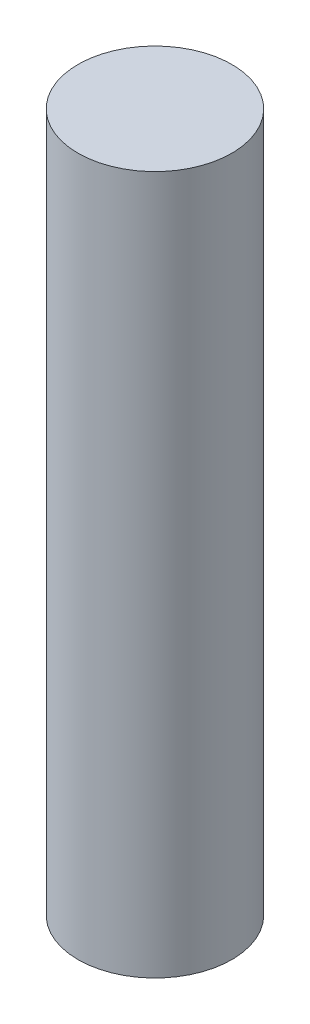
ISO-10303-21;
HEADER;
FILE_DESCRIPTION(('STEP AP214'),'2;1');
FILE_NAME('part.step','',(''),(''),'','','');
FILE_SCHEMA(('AUTOMOTIVE_DESIGN { 1 0 10303 214 1 1 1 1 }'));
ENDSEC;
DATA;
#1=APPLICATION_CONTEXT('core data for automotive mechanical design processes');
#2=APPLICATION_PROTOCOL_DEFINITION('international standard','automotive_design',2000,#1);
#3=PRODUCT_CONTEXT('',#1,'mechanical');
#4=PRODUCT('Part','Part','',(#3));
#5=PRODUCT_RELATED_PRODUCT_CATEGORY('part','',(#4));
#6=PRODUCT_DEFINITION_FORMATION('','',#4);
#7=PRODUCT_DEFINITION_CONTEXT('part definition',#1,'design');
#8=PRODUCT_DEFINITION('design','',#6,#7);
#9=PRODUCT_DEFINITION_SHAPE('','',#8);
#10=(LENGTH_UNIT() NAMED_UNIT(*) SI_UNIT(.MILLI.,.METRE.));
#11=(NAMED_UNIT(*) PLANE_ANGLE_UNIT() SI_UNIT($,.RADIAN.));
#12=(NAMED_UNIT(*) SI_UNIT($,.STERADIAN.) SOLID_ANGLE_UNIT());
#13=UNCERTAINTY_MEASURE_WITH_UNIT(LENGTH_MEASURE(1.E-05),#10,'distance_accuracy_value','');
#14=(GEOMETRIC_REPRESENTATION_CONTEXT(3) GLOBAL_UNCERTAINTY_ASSIGNED_CONTEXT((#13)) GLOBAL_UNIT_ASSIGNED_CONTEXT((#10,
#11,#12)) REPRESENTATION_CONTEXT('',''));
#15=CARTESIAN_POINT('',(0.,0.,0.));
#16=DIRECTION('',(0.,0.,1.));
#17=DIRECTION('',(1.,0.,0.));
#18=AXIS2_PLACEMENT_3D('',#15,#16,#17);
#19=CARTESIAN_POINT('',(0.,98.,0.));
#20=DIRECTION('',(0.,-1.,0.));
#21=DIRECTION('',(0.,0.,-1.));
#22=AXIS2_PLACEMENT_3D('',#19,#20,#21);
#23=CYLINDRICAL_SURFACE('',#22,10.795);
#24=CARTESIAN_POINT('',(0.,98.,0.));
#25=DIRECTION('',(0.,1.,0.));
#26=DIRECTION('',(0.,0.,1.));
#27=AXIS2_PLACEMENT_3D('',#24,#25,#26);
#28=CIRCLE('',#27,10.795);
#29=CARTESIAN_POINT('',(0.,98.,10.795));
#30=VERTEX_POINT('',#29);
#31=EDGE_CURVE('E10',#30,#30,#28,.T.);
#32=ORIENTED_EDGE('',*,*,#31,.F.);
#33=EDGE_LOOP('',(#32));
#34=FACE_BOUND('',#33,.T.);
#35=CARTESIAN_POINT('',(0.,0.,0.));
#36=DIRECTION('',(0.,1.,0.));
#37=DIRECTION('',(0.,0.,1.));
#38=AXIS2_PLACEMENT_3D('',#35,#36,#37);
#39=CIRCLE('',#38,10.795);
#40=CARTESIAN_POINT('',(0.,0.,10.795));
#41=VERTEX_POINT('',#40);
#42=EDGE_CURVE('E40',#41,#41,#39,.T.);
#43=ORIENTED_EDGE('',*,*,#42,.T.);
#44=EDGE_LOOP('',(#43));
#45=FACE_BOUND('',#44,.T.);
#46=ADVANCED_FACE('F37',(#34,#45),#23,.T.);
#47=CARTESIAN_POINT('',(0.,98.,0.));
#48=DIRECTION('',(0.,1.,0.));
#49=DIRECTION('',(0.,0.,1.));
#50=AXIS2_PLACEMENT_3D('',#47,#48,#49);
#51=PLANE('',#50);
#52=ORIENTED_EDGE('',*,*,#31,.T.);
#53=EDGE_LOOP('',(#52));
#54=FACE_BOUND('',#53,.T.);
#55=ADVANCED_FACE('F54',(#54),#51,.T.);
#56=CARTESIAN_POINT('',(0.,0.,0.));
#57=DIRECTION('',(0.,1.,0.));
#58=DIRECTION('',(0.,0.,1.));
#59=AXIS2_PLACEMENT_3D('',#56,#57,#58);
#60=PLANE('',#59);
#61=ORIENTED_EDGE('',*,*,#42,.F.);
#62=EDGE_LOOP('',(#61));
#63=FACE_BOUND('',#62,.T.);
#64=ADVANCED_FACE('F52',(#63),#60,.F.);
#65=CLOSED_SHELL('',(#46,#55,#64));
#66=MANIFOLD_SOLID_BREP('B2',#65);
#67=ADVANCED_BREP_SHAPE_REPRESENTATION('',(#18,#66),#14);
#68=SHAPE_DEFINITION_REPRESENTATION(#9,#67);
ENDSEC;
END-ISO-10303-21;
